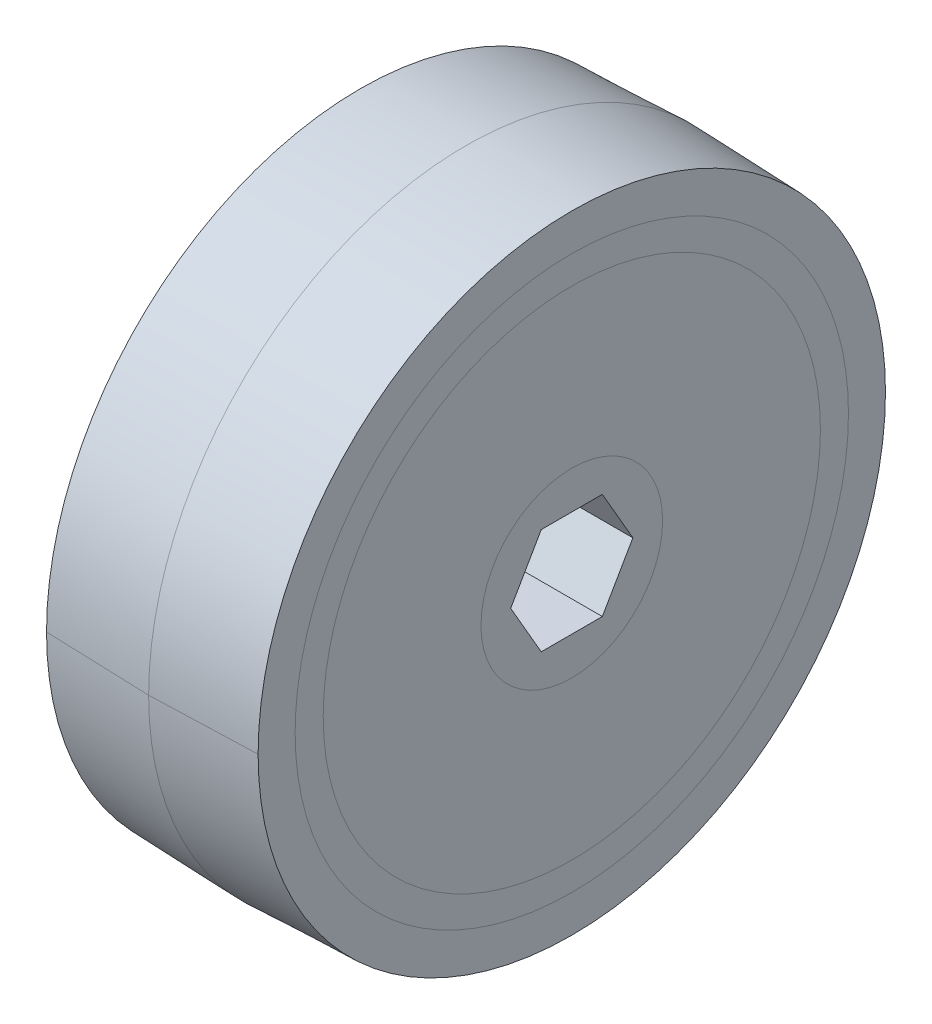
ISO-10303-21;
HEADER;
FILE_DESCRIPTION(('STEP AP214'),'2;1');
FILE_NAME('part.step','',(''),(''),'','','');
FILE_SCHEMA(('AUTOMOTIVE_DESIGN { 1 0 10303 214 1 1 1 1 }'));
ENDSEC;
DATA;
#1=APPLICATION_CONTEXT('core data for automotive mechanical design processes');
#2=APPLICATION_PROTOCOL_DEFINITION('international standard','automotive_design',2000,#1);
#3=PRODUCT_CONTEXT('',#1,'mechanical');
#4=PRODUCT('Part','Part','',(#3));
#5=PRODUCT_RELATED_PRODUCT_CATEGORY('part','',(#4));
#6=PRODUCT_DEFINITION_FORMATION('','',#4);
#7=PRODUCT_DEFINITION_CONTEXT('part definition',#1,'design');
#8=PRODUCT_DEFINITION('design','',#6,#7);
#9=PRODUCT_DEFINITION_SHAPE('','',#8);
#10=(LENGTH_UNIT() NAMED_UNIT(*) SI_UNIT(.MILLI.,.METRE.));
#11=(NAMED_UNIT(*) PLANE_ANGLE_UNIT() SI_UNIT($,.RADIAN.));
#12=(NAMED_UNIT(*) SI_UNIT($,.STERADIAN.) SOLID_ANGLE_UNIT());
#13=UNCERTAINTY_MEASURE_WITH_UNIT(LENGTH_MEASURE(1.E-05),#10,'distance_accuracy_value','');
#14=(GEOMETRIC_REPRESENTATION_CONTEXT(3) GLOBAL_UNCERTAINTY_ASSIGNED_CONTEXT((#13)) GLOBAL_UNIT_ASSIGNED_CONTEXT((#10,
#11,#12)) REPRESENTATION_CONTEXT('',''));
#15=CARTESIAN_POINT('',(0.,0.,0.));
#16=DIRECTION('',(0.,0.,1.));
#17=DIRECTION('',(1.,0.,0.));
#18=AXIS2_PLACEMENT_3D('',#15,#16,#17);
#19=CARTESIAN_POINT('',(33.4602057668382,67.3416858130658,54.646009210285));
#20=DIRECTION('',(1.,0.,0.));
#21=DIRECTION('',(0.,1.,0.));
#22=AXIS2_PLACEMENT_3D('',#19,#20,#21);
#23=PLANE('',#22);
#24=CARTESIAN_POINT('',(33.4602057668382,34.130179585611,54.646009210285));
#25=DIRECTION('',(-1.,0.,0.));
#26=DIRECTION('',(0.,0.,-1.));
#27=AXIS2_PLACEMENT_3D('',#24,#25,#26);
#28=CIRCLE('',#27,33.2115062274549);
#29=CARTESIAN_POINT('',(33.4602057668382,34.130179585611,87.8575154377399));
#30=VERTEX_POINT('',#29);
#31=CARTESIAN_POINT('',(33.4602057668382,34.130179585611,21.4345029828301));
#32=VERTEX_POINT('',#31);
#33=EDGE_CURVE('E261',#30,#32,#28,.T.);
#34=ORIENTED_EDGE('',*,*,#33,.T.);
#35=CARTESIAN_POINT('',(33.4602057668382,34.130179585611,54.646009210285));
#36=DIRECTION('',(-1.,0.,0.));
#37=DIRECTION('',(0.,0.,-1.));
#38=AXIS2_PLACEMENT_3D('',#35,#36,#37);
#39=CIRCLE('',#38,33.2115062274549);
#40=EDGE_CURVE('E260',#32,#30,#39,.T.);
#41=ORIENTED_EDGE('',*,*,#40,.T.);
#42=EDGE_LOOP('',(#34,#41));
#43=FACE_BOUND('',#42,.T.);
#44=CARTESIAN_POINT('',(33.4602057668382,34.130179585611,54.646009210285));
#45=DIRECTION('',(1.,0.,0.));
#46=DIRECTION('',(0.,0.,-1.));
#47=AXIS2_PLACEMENT_3D('',#44,#45,#46);
#48=CIRCLE('',#47,37.6565062274548);
#49=CARTESIAN_POINT('',(33.4602057668382,34.130179585611,92.3025154377398));
#50=VERTEX_POINT('',#49);
#51=CARTESIAN_POINT('',(33.4602057668382,34.130179585611,16.9895029828302));
#52=VERTEX_POINT('',#51);
#53=EDGE_CURVE('E239',#50,#52,#48,.T.);
#54=ORIENTED_EDGE('',*,*,#53,.T.);
#55=CARTESIAN_POINT('',(33.4602057668382,34.130179585611,54.646009210285));
#56=DIRECTION('',(1.,0.,0.));
#57=DIRECTION('',(0.,0.,-1.));
#58=AXIS2_PLACEMENT_3D('',#55,#56,#57);
#59=CIRCLE('',#58,37.6565062274548);
#60=EDGE_CURVE('E227',#52,#50,#59,.T.);
#61=ORIENTED_EDGE('',*,*,#60,.T.);
#62=EDGE_LOOP('',(#54,#61));
#63=FACE_BOUND('',#62,.T.);
#64=ADVANCED_FACE('F27',(#43,#63),#23,.T.);
#65=CARTESIAN_POINT('',(8.06020576683822,67.3416858130658,54.646009210285));
#66=DIRECTION('',(-1.,0.,0.));
#67=DIRECTION('',(0.,0.,1.));
#68=AXIS2_PLACEMENT_3D('',#65,#66,#67);
#69=PLANE('',#68);
#70=CARTESIAN_POINT('',(8.06020576683824,34.130179585611,54.646009210285));
#71=DIRECTION('',(1.,0.,0.));
#72=DIRECTION('',(0.,0.,1.));
#73=AXIS2_PLACEMENT_3D('',#70,#71,#72);
#74=CIRCLE('',#73,33.2115062274548);
#75=CARTESIAN_POINT('',(8.06020576683824,34.130179585611,21.4345029828302));
#76=VERTEX_POINT('',#75);
#77=CARTESIAN_POINT('',(8.06020576683822,34.130179585611,87.8575154377398));
#78=VERTEX_POINT('',#77);
#79=EDGE_CURVE('E254',#76,#78,#74,.T.);
#80=ORIENTED_EDGE('',*,*,#79,.T.);
#81=CARTESIAN_POINT('',(8.06020576683824,34.130179585611,54.646009210285));
#82=DIRECTION('',(1.,0.,0.));
#83=DIRECTION('',(0.,0.,1.));
#84=AXIS2_PLACEMENT_3D('',#81,#82,#83);
#85=CIRCLE('',#84,33.2115062274548);
#86=EDGE_CURVE('E304',#78,#76,#85,.T.);
#87=ORIENTED_EDGE('',*,*,#86,.T.);
#88=EDGE_LOOP('',(#80,#87));
#89=FACE_BOUND('',#88,.T.);
#90=CARTESIAN_POINT('',(8.06020576683822,34.130179585611,54.646009210285));
#91=DIRECTION('',(1.,0.,0.));
#92=DIRECTION('',(0.,0.,-1.));
#93=AXIS2_PLACEMENT_3D('',#90,#91,#92);
#94=CIRCLE('',#93,37.6565062274548);
#95=CARTESIAN_POINT('',(8.06020576683822,34.130179585611,16.9895029828302));
#96=VERTEX_POINT('',#95);
#97=CARTESIAN_POINT('',(8.06020576683822,34.130179585611,92.3025154377398));
#98=VERTEX_POINT('',#97);
#99=EDGE_CURVE('E217',#96,#98,#94,.T.);
#100=ORIENTED_EDGE('',*,*,#99,.F.);
#101=CARTESIAN_POINT('',(8.06020576683822,34.130179585611,54.646009210285));
#102=DIRECTION('',(1.,0.,0.));
#103=DIRECTION('',(0.,0.,-1.));
#104=AXIS2_PLACEMENT_3D('',#101,#102,#103);
#105=CIRCLE('',#104,37.6565062274548);
#106=EDGE_CURVE('E245',#98,#96,#105,.T.);
#107=ORIENTED_EDGE('',*,*,#106,.F.);
#108=EDGE_LOOP('',(#100,#107));
#109=FACE_BOUND('',#108,.T.);
#110=ADVANCED_FACE('F2999',(#89,#109),#69,.T.);
#111=CARTESIAN_POINT('',(20.7602057668382,34.130179585611,54.646009210285));
#112=DIRECTION('',(1.,0.,0.));
#113=DIRECTION('',(0.,0.,-1.));
#114=AXIS2_PLACEMENT_3D('',#111,#112,#113);
#115=CONICAL_SURFACE('',#114,38.1,0.0349065850398857);
#116=DIRECTION('',(0.999390827019096,0.,0.0348994967025016));
#117=VECTOR('',#116,1.);
#118=CARTESIAN_POINT('',(20.7602057668382,34.130179585611,92.746009210285));
#119=LINE('',#118,#117);
#120=CARTESIAN_POINT('',(20.7602057668382,34.130179585611,92.746009210285));
#121=VERTEX_POINT('',#120);
#122=EDGE_CURVE('E221',#98,#121,#119,.T.);
#123=ORIENTED_EDGE('',*,*,#122,.F.);
#124=ORIENTED_EDGE('',*,*,#106,.T.);
#125=DIRECTION('',(0.999390827019096,0.,-0.0348994967025016));
#126=VECTOR('',#125,1.);
#127=CARTESIAN_POINT('',(20.7602057668382,34.130179585611,16.546009210285));
#128=LINE('',#127,#126);
#129=CARTESIAN_POINT('',(20.7602057668382,34.130179585611,16.546009210285));
#130=VERTEX_POINT('',#129);
#131=EDGE_CURVE('E235',#96,#130,#128,.T.);
#132=ORIENTED_EDGE('',*,*,#131,.T.);
#133=CARTESIAN_POINT('',(20.7602057668382,34.130179585611,54.646009210285));
#134=DIRECTION('',(1.,0.,0.));
#135=DIRECTION('',(0.,0.,-1.));
#136=AXIS2_PLACEMENT_3D('',#133,#134,#135);
#137=CIRCLE('',#136,38.1);
#138=EDGE_CURVE('E242',#121,#130,#137,.T.);
#139=ORIENTED_EDGE('',*,*,#138,.F.);
#140=EDGE_LOOP('',(#123,#124,#132,#139));
#141=FACE_BOUND('',#140,.T.);
#142=ADVANCED_FACE('F3017',(#141),#115,.T.);
#143=CARTESIAN_POINT('',(33.4602057668382,34.130179585611,54.646009210285));
#144=DIRECTION('',(-1.,0.,0.));
#145=DIRECTION('',(0.,0.,1.));
#146=AXIS2_PLACEMENT_3D('',#143,#144,#145);
#147=CONICAL_SURFACE('',#146,37.6565062274548,0.0349065850398857);
#148=DIRECTION('',(-0.999390827019096,0.,-0.0348994967025005));
#149=VECTOR('',#148,1.);
#150=CARTESIAN_POINT('',(33.4602057668382,34.130179585611,16.9895029828302));
#151=LINE('',#150,#149);
#152=EDGE_CURVE('E222',#52,#130,#151,.T.);
#153=ORIENTED_EDGE('',*,*,#152,.F.);
#154=ORIENTED_EDGE('',*,*,#53,.F.);
#155=DIRECTION('',(-0.999390827019096,0.,0.0348994967025005));
#156=VECTOR('',#155,1.);
#157=CARTESIAN_POINT('',(33.4602057668382,34.130179585611,92.3025154377398));
#158=LINE('',#157,#156);
#159=EDGE_CURVE('E226',#50,#121,#158,.T.);
#160=ORIENTED_EDGE('',*,*,#159,.T.);
#161=ORIENTED_EDGE('',*,*,#138,.T.);
#162=EDGE_LOOP('',(#153,#154,#160,#161));
#163=FACE_BOUND('',#162,.T.);
#164=ADVANCED_FACE('F3058',(#163),#147,.T.);
#165=CARTESIAN_POINT('',(33.4602057668382,34.130179585611,54.646009210285));
#166=DIRECTION('',(-1.,0.,0.));
#167=DIRECTION('',(0.,0.,1.));
#168=AXIS2_PLACEMENT_3D('',#165,#166,#167);
#169=CONICAL_SURFACE('',#168,37.6565062274548,0.0349065850398857);
#170=ORIENTED_EDGE('',*,*,#60,.F.);
#171=ORIENTED_EDGE('',*,*,#152,.T.);
#172=CARTESIAN_POINT('',(20.7602057668382,34.130179585611,54.646009210285));
#173=DIRECTION('',(1.,0.,0.));
#174=DIRECTION('',(0.,0.,-1.));
#175=AXIS2_PLACEMENT_3D('',#172,#173,#174);
#176=CIRCLE('',#175,38.1);
#177=EDGE_CURVE('E231',#130,#121,#176,.T.);
#178=ORIENTED_EDGE('',*,*,#177,.T.);
#179=ORIENTED_EDGE('',*,*,#159,.F.);
#180=EDGE_LOOP('',(#170,#171,#178,#179));
#181=FACE_BOUND('',#180,.T.);
#182=ADVANCED_FACE('F3010',(#181),#169,.T.);
#183=CARTESIAN_POINT('',(20.7602057668382,34.130179585611,54.646009210285));
#184=DIRECTION('',(1.,0.,0.));
#185=DIRECTION('',(0.,0.,-1.));
#186=AXIS2_PLACEMENT_3D('',#183,#184,#185);
#187=CONICAL_SURFACE('',#186,38.1,0.0349065850398857);
#188=ORIENTED_EDGE('',*,*,#99,.T.);
#189=ORIENTED_EDGE('',*,*,#122,.T.);
#190=ORIENTED_EDGE('',*,*,#177,.F.);
#191=ORIENTED_EDGE('',*,*,#131,.F.);
#192=EDGE_LOOP('',(#188,#189,#190,#191));
#193=FACE_BOUND('',#192,.T.);
#194=ADVANCED_FACE('F3002',(#193),#187,.T.);
#195=CARTESIAN_POINT('',(8.06020576683824,40.480179585611,54.646009210285));
#196=DIRECTION('',(-1.,0.,0.));
#197=DIRECTION('',(0.,0.,1.));
#198=AXIS2_PLACEMENT_3D('',#195,#196,#197);
#199=PLANE('',#198);
#200=DIRECTION('',(0.,0.,-1.));
#201=VECTOR('',#200,1.);
#202=CARTESIAN_POINT('',(8.06020576683824,27.780179585611,58.3121834196391));
#203=LINE('',#202,#201);
#204=CARTESIAN_POINT('',(8.06020576683824,27.780179585611,58.3121834196391));
#205=VERTEX_POINT('',#204);
#206=CARTESIAN_POINT('',(8.06020576683824,27.780179585611,50.9798350009309));
#207=VERTEX_POINT('',#206);
#208=EDGE_CURVE('E48',#205,#207,#203,.T.);
#209=ORIENTED_EDGE('',*,*,#208,.T.);
#210=DIRECTION('',(0.,0.866025403784439,-0.5));
#211=VECTOR('',#210,1.);
#212=CARTESIAN_POINT('',(8.06020576683824,27.780179585611,50.9798350009309));
#213=LINE('',#212,#211);
#214=CARTESIAN_POINT('',(8.06020576683824,34.130179585611,47.3136607915768));
#215=VERTEX_POINT('',#214);
#216=EDGE_CURVE('E200',#207,#215,#213,.T.);
#217=ORIENTED_EDGE('',*,*,#216,.T.);
#218=DIRECTION('',(0.,0.866025403784439,0.5));
#219=VECTOR('',#218,1.);
#220=CARTESIAN_POINT('',(8.06020576683824,34.130179585611,47.3136607915768));
#221=LINE('',#220,#219);
#222=CARTESIAN_POINT('',(8.06020576683824,40.480179585611,50.9798350009309));
#223=VERTEX_POINT('',#222);
#224=EDGE_CURVE('E190',#215,#223,#221,.T.);
#225=ORIENTED_EDGE('',*,*,#224,.T.);
#226=DIRECTION('',(0.,0.,1.));
#227=VECTOR('',#226,1.);
#228=CARTESIAN_POINT('',(8.06020576683824,40.480179585611,50.9798350009309));
#229=LINE('',#228,#227);
#230=CARTESIAN_POINT('',(8.06020576683824,40.480179585611,58.3121834196391));
#231=VERTEX_POINT('',#230);
#232=EDGE_CURVE('E168',#223,#231,#229,.T.);
#233=ORIENTED_EDGE('',*,*,#232,.T.);
#234=DIRECTION('',(0.,-0.866025403784439,0.5));
#235=VECTOR('',#234,1.);
#236=CARTESIAN_POINT('',(8.06020576683824,40.480179585611,58.3121834196391));
#237=LINE('',#236,#235);
#238=CARTESIAN_POINT('',(8.06020576683824,34.130179585611,61.9783576289933));
#239=VERTEX_POINT('',#238);
#240=EDGE_CURVE('E160',#231,#239,#237,.T.);
#241=ORIENTED_EDGE('',*,*,#240,.T.);
#242=DIRECTION('',(0.,-0.866025403784439,-0.5));
#243=VECTOR('',#242,1.);
#244=CARTESIAN_POINT('',(8.06020576683824,34.130179585611,61.9783576289933));
#245=LINE('',#244,#243);
#246=EDGE_CURVE('E150',#239,#205,#245,.T.);
#247=ORIENTED_EDGE('',*,*,#246,.T.);
#248=EDGE_LOOP('',(#209,#217,#225,#233,#241,#247));
#249=FACE_BOUND('',#248,.T.);
#250=ORIENTED_EDGE('',*,*,#79,.F.);
#251=ORIENTED_EDGE('',*,*,#86,.F.);
#252=EDGE_LOOP('',(#250,#251));
#253=FACE_BOUND('',#252,.T.);
#254=ADVANCED_FACE('F165',(#249,#253),#199,.T.);
#255=CARTESIAN_POINT('',(33.4602057668382,63.975179585611,54.646009210285));
#256=DIRECTION('',(1.,0.,0.));
#257=DIRECTION('',(0.,1.,0.));
#258=AXIS2_PLACEMENT_3D('',#255,#256,#257);
#259=PLANE('',#258);
#260=ORIENTED_EDGE('',*,*,#33,.F.);
#261=ORIENTED_EDGE('',*,*,#40,.F.);
#262=EDGE_LOOP('',(#260,#261));
#263=FACE_BOUND('',#262,.T.);
#264=CARTESIAN_POINT('',(33.4602057668382,34.130179585611,54.646009210285));
#265=DIRECTION('',(1.,0.,0.));
#266=DIRECTION('',(0.,0.,-1.));
#267=AXIS2_PLACEMENT_3D('',#264,#265,#266);
#268=CIRCLE('',#267,29.845);
#269=CARTESIAN_POINT('',(33.4602057668382,34.130179585611,24.801009210285));
#270=VERTEX_POINT('',#269);
#271=EDGE_CURVE('E13',#270,#270,#268,.T.);
#272=ORIENTED_EDGE('',*,*,#271,.F.);
#273=EDGE_LOOP('',(#272));
#274=FACE_BOUND('',#273,.T.);
#275=ADVANCED_FACE('F2990',(#263,#274),#259,.T.);
#276=CARTESIAN_POINT('',(33.4602057668382,34.130179585611,54.646009210285));
#277=DIRECTION('',(1.,0.,0.));
#278=DIRECTION('',(0.,0.,-1.));
#279=AXIS2_PLACEMENT_3D('',#276,#277,#278);
#280=CIRCLE('',#279,10.9032974947185);
#281=CARTESIAN_POINT('',(33.4602057668382,34.130179585611,43.7427117155665));
#282=VERTEX_POINT('',#281);
#283=CARTESIAN_POINT('',(33.4602057668382,34.130179585611,65.5493067050035));
#284=VERTEX_POINT('',#283);
#285=EDGE_CURVE('E255',#282,#284,#280,.T.);
#286=ORIENTED_EDGE('',*,*,#285,.F.);
#287=CARTESIAN_POINT('',(33.4602057668382,34.130179585611,54.646009210285));
#288=DIRECTION('',(1.,0.,0.));
#289=DIRECTION('',(0.,0.,-1.));
#290=AXIS2_PLACEMENT_3D('',#287,#288,#289);
#291=CIRCLE('',#290,10.9032974947185);
#292=EDGE_CURVE('E36',#284,#282,#291,.T.);
#293=ORIENTED_EDGE('',*,*,#292,.F.);
#294=EDGE_LOOP('',(#286,#293));
#295=FACE_BOUND('',#294,.T.);
#296=ORIENTED_EDGE('',*,*,#271,.T.);
#297=EDGE_LOOP('',(#296));
#298=FACE_BOUND('',#297,.T.);
#299=ADVANCED_FACE('F3008',(#295,#298),#23,.T.);
#300=CARTESIAN_POINT('',(33.4602057668382,40.480179585611,54.646009210285));
#301=DIRECTION('',(1.,0.,0.));
#302=DIRECTION('',(0.,1.,0.));
#303=AXIS2_PLACEMENT_3D('',#300,#301,#302);
#304=PLANE('',#303);
#305=DIRECTION('',(0.,0.,-1.));
#306=VECTOR('',#305,1.);
#307=CARTESIAN_POINT('',(33.4602057668382,27.780179585611,54.646009210285));
#308=LINE('',#307,#306);
#309=CARTESIAN_POINT('',(33.4602057668382,27.780179585611,58.3121834196391));
#310=VERTEX_POINT('',#309);
#311=CARTESIAN_POINT('',(33.4602057668382,27.780179585611,50.9798350009309));
#312=VERTEX_POINT('',#311);
#313=EDGE_CURVE('E213',#310,#312,#308,.T.);
#314=ORIENTED_EDGE('',*,*,#313,.F.);
#315=DIRECTION('',(0.,-0.866025403784439,-0.5));
#316=VECTOR('',#315,1.);
#317=CARTESIAN_POINT('',(33.4602057668382,35.717679585611,62.8949011813318));
#318=LINE('',#317,#316);
#319=CARTESIAN_POINT('',(33.4602057668382,34.130179585611,61.9783576289933));
#320=VERTEX_POINT('',#319);
#321=EDGE_CURVE('E157',#320,#310,#318,.T.);
#322=ORIENTED_EDGE('',*,*,#321,.F.);
#323=DIRECTION('',(0.,-0.866025403784439,0.5));
#324=VECTOR('',#323,1.);
#325=CARTESIAN_POINT('',(33.4602057668382,42.067679585611,57.3956398673006));
#326=LINE('',#325,#324);
#327=CARTESIAN_POINT('',(33.4602057668382,40.480179585611,58.3121834196391));
#328=VERTEX_POINT('',#327);
#329=EDGE_CURVE('E59',#328,#320,#326,.T.);
#330=ORIENTED_EDGE('',*,*,#329,.F.);
#331=DIRECTION('',(0.,0.,1.));
#332=VECTOR('',#331,1.);
#333=CARTESIAN_POINT('',(33.4602057668382,40.480179585611,54.646009210285));
#334=LINE('',#333,#332);
#335=CARTESIAN_POINT('',(33.4602057668382,40.480179585611,50.9798350009309));
#336=VERTEX_POINT('',#335);
#337=EDGE_CURVE('E186',#336,#328,#334,.T.);
#338=ORIENTED_EDGE('',*,*,#337,.F.);
#339=DIRECTION('',(0.,0.866025403784439,0.5));
#340=VECTOR('',#339,1.);
#341=CARTESIAN_POINT('',(33.4602057668382,42.067679585611,51.8963785532694));
#342=LINE('',#341,#340);
#343=CARTESIAN_POINT('',(33.4602057668382,34.130179585611,47.3136607915768));
#344=VERTEX_POINT('',#343);
#345=EDGE_CURVE('E196',#344,#336,#342,.T.);
#346=ORIENTED_EDGE('',*,*,#345,.F.);
#347=DIRECTION('',(0.,0.866025403784439,-0.5));
#348=VECTOR('',#347,1.);
#349=CARTESIAN_POINT('',(33.4602057668382,35.717679585611,46.3971172392382));
#350=LINE('',#349,#348);
#351=EDGE_CURVE('E207',#312,#344,#350,.T.);
#352=ORIENTED_EDGE('',*,*,#351,.F.);
#353=EDGE_LOOP('',(#314,#322,#330,#338,#346,#352));
#354=FACE_BOUND('',#353,.T.);
#355=ORIENTED_EDGE('',*,*,#292,.T.);
#356=ORIENTED_EDGE('',*,*,#285,.T.);
#357=EDGE_LOOP('',(#355,#356));
#358=FACE_BOUND('',#357,.T.);
#359=ADVANCED_FACE('F29',(#354,#358),#304,.T.);
#360=CARTESIAN_POINT('',(8.06020576683824,27.780179585611,58.3121834196391));
#361=DIRECTION('',(0.,-1.,0.));
#362=DIRECTION('',(0.,0.,-1.));
#363=AXIS2_PLACEMENT_3D('',#360,#361,#362);
#364=PLANE('',#363);
#365=ORIENTED_EDGE('',*,*,#208,.F.);
#366=DIRECTION('',(1.,0.,0.));
#367=VECTOR('',#366,1.);
#368=CARTESIAN_POINT('',(8.06020576683824,27.780179585611,58.3121834196391));
#369=LINE('',#368,#367);
#370=EDGE_CURVE('E154',#205,#310,#369,.T.);
#371=ORIENTED_EDGE('',*,*,#370,.T.);
#372=ORIENTED_EDGE('',*,*,#313,.T.);
#373=DIRECTION('',(1.,0.,0.));
#374=VECTOR('',#373,1.);
#375=CARTESIAN_POINT('',(8.06020576683824,27.780179585611,50.9798350009309));
#376=LINE('',#375,#374);
#377=EDGE_CURVE('E204',#207,#312,#376,.T.);
#378=ORIENTED_EDGE('',*,*,#377,.F.);
#379=EDGE_LOOP('',(#365,#371,#372,#378));
#380=FACE_BOUND('',#379,.T.);
#381=ADVANCED_FACE('F3025',(#380),#364,.F.);
#382=CARTESIAN_POINT('',(8.06020576683824,27.780179585611,50.9798350009309));
#383=DIRECTION('',(0.,-0.5,-0.866025403784439));
#384=DIRECTION('',(0.,-0.866025403784439,0.5));
#385=AXIS2_PLACEMENT_3D('',#382,#383,#384);
#386=PLANE('',#385);
#387=ORIENTED_EDGE('',*,*,#216,.F.);
#388=ORIENTED_EDGE('',*,*,#377,.T.);
#389=ORIENTED_EDGE('',*,*,#351,.T.);
#390=DIRECTION('',(1.,0.,0.));
#391=VECTOR('',#390,1.);
#392=CARTESIAN_POINT('',(8.06020576683824,34.130179585611,47.3136607915768));
#393=LINE('',#392,#391);
#394=EDGE_CURVE('E193',#215,#344,#393,.T.);
#395=ORIENTED_EDGE('',*,*,#394,.F.);
#396=EDGE_LOOP('',(#387,#388,#389,#395));
#397=FACE_BOUND('',#396,.T.);
#398=ADVANCED_FACE('F3033',(#397),#386,.F.);
#399=CARTESIAN_POINT('',(8.06020576683824,34.130179585611,47.3136607915768));
#400=DIRECTION('',(0.,0.5,-0.866025403784439));
#401=DIRECTION('',(-1.,0.,0.));
#402=AXIS2_PLACEMENT_3D('',#399,#400,#401);
#403=PLANE('',#402);
#404=ORIENTED_EDGE('',*,*,#224,.F.);
#405=ORIENTED_EDGE('',*,*,#394,.T.);
#406=ORIENTED_EDGE('',*,*,#345,.T.);
#407=DIRECTION('',(1.,0.,0.));
#408=VECTOR('',#407,1.);
#409=CARTESIAN_POINT('',(8.06020576683824,40.480179585611,50.9798350009309));
#410=LINE('',#409,#408);
#411=EDGE_CURVE('E183',#223,#336,#410,.T.);
#412=ORIENTED_EDGE('',*,*,#411,.F.);
#413=EDGE_LOOP('',(#404,#405,#406,#412));
#414=FACE_BOUND('',#413,.T.);
#415=ADVANCED_FACE('F3041',(#414),#403,.F.);
#416=CARTESIAN_POINT('',(8.06020576683824,40.480179585611,50.9798350009309));
#417=DIRECTION('',(0.,1.,0.));
#418=DIRECTION('',(1.,0.,0.));
#419=AXIS2_PLACEMENT_3D('',#416,#417,#418);
#420=PLANE('',#419);
#421=ORIENTED_EDGE('',*,*,#232,.F.);
#422=ORIENTED_EDGE('',*,*,#411,.T.);
#423=ORIENTED_EDGE('',*,*,#337,.T.);
#424=DIRECTION('',(1.,0.,0.));
#425=VECTOR('',#424,1.);
#426=CARTESIAN_POINT('',(8.06020576683824,40.480179585611,58.3121834196391));
#427=LINE('',#426,#425);
#428=EDGE_CURVE('E170',#231,#328,#427,.T.);
#429=ORIENTED_EDGE('',*,*,#428,.F.);
#430=EDGE_LOOP('',(#421,#422,#423,#429));
#431=FACE_BOUND('',#430,.T.);
#432=ADVANCED_FACE('F3045',(#431),#420,.F.);
#433=CARTESIAN_POINT('',(8.06020576683824,40.480179585611,58.3121834196391));
#434=DIRECTION('',(0.,0.5,0.866025403784439));
#435=DIRECTION('',(1.,0.,0.));
#436=AXIS2_PLACEMENT_3D('',#433,#434,#435);
#437=PLANE('',#436);
#438=ORIENTED_EDGE('',*,*,#240,.F.);
#439=ORIENTED_EDGE('',*,*,#428,.T.);
#440=ORIENTED_EDGE('',*,*,#329,.T.);
#441=DIRECTION('',(1.,0.,0.));
#442=VECTOR('',#441,1.);
#443=CARTESIAN_POINT('',(8.06020576683824,34.130179585611,61.9783576289933));
#444=LINE('',#443,#442);
#445=EDGE_CURVE('E152',#239,#320,#444,.T.);
#446=ORIENTED_EDGE('',*,*,#445,.F.);
#447=EDGE_LOOP('',(#438,#439,#440,#446));
#448=FACE_BOUND('',#447,.T.);
#449=ADVANCED_FACE('F159',(#448),#437,.F.);
#450=CARTESIAN_POINT('',(8.06020576683824,34.130179585611,61.9783576289933));
#451=DIRECTION('',(0.,-0.5,0.866025403784439));
#452=DIRECTION('',(-1.,0.,0.));
#453=AXIS2_PLACEMENT_3D('',#450,#451,#452);
#454=PLANE('',#453);
#455=ORIENTED_EDGE('',*,*,#246,.F.);
#456=ORIENTED_EDGE('',*,*,#445,.T.);
#457=ORIENTED_EDGE('',*,*,#321,.T.);
#458=ORIENTED_EDGE('',*,*,#370,.F.);
#459=EDGE_LOOP('',(#455,#456,#457,#458));
#460=FACE_BOUND('',#459,.T.);
#461=ADVANCED_FACE('F151',(#460),#454,.F.);
#462=CLOSED_SHELL('',(#64,#110,#142,#164,#182,#194,#254,#275,#299,#359,#381,#398,#415,#432,#449,#461));
#463=MANIFOLD_SOLID_BREP('B1',#462);
#464=ADVANCED_BREP_SHAPE_REPRESENTATION('',(#18,#463),#14);
#465=SHAPE_DEFINITION_REPRESENTATION(#9,#464);
ENDSEC;
END-ISO-10303-21;
